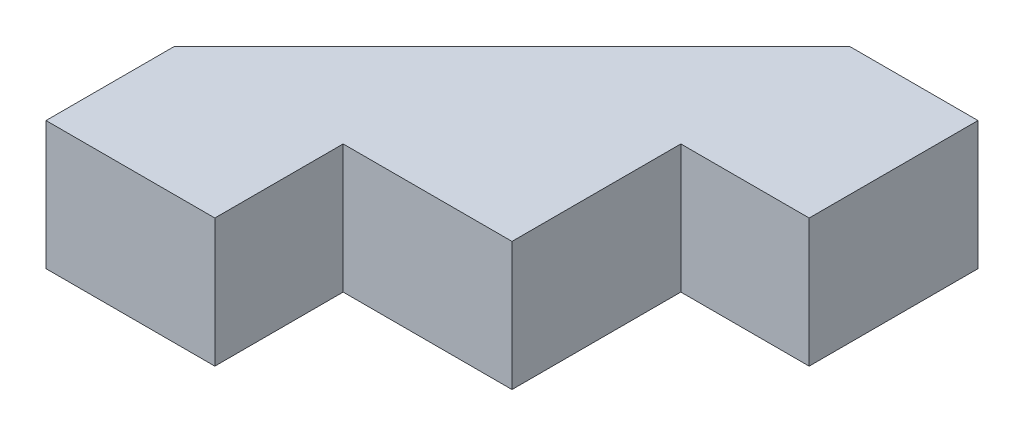
ISO-10303-21;
HEADER;
FILE_DESCRIPTION(('STEP AP214'),'2;1');
FILE_NAME('part.step','',(''),(''),'','','');
FILE_SCHEMA(('AUTOMOTIVE_DESIGN { 1 0 10303 214 1 1 1 1 }'));
ENDSEC;
DATA;
#1=APPLICATION_CONTEXT('core data for automotive mechanical design processes');
#2=APPLICATION_PROTOCOL_DEFINITION('international standard','automotive_design',2000,#1);
#3=PRODUCT_CONTEXT('',#1,'mechanical');
#4=PRODUCT('Part','Part','',(#3));
#5=PRODUCT_RELATED_PRODUCT_CATEGORY('part','',(#4));
#6=PRODUCT_DEFINITION_FORMATION('','',#4);
#7=PRODUCT_DEFINITION_CONTEXT('part definition',#1,'design');
#8=PRODUCT_DEFINITION('design','',#6,#7);
#9=PRODUCT_DEFINITION_SHAPE('','',#8);
#10=(LENGTH_UNIT() NAMED_UNIT(*) SI_UNIT(.MILLI.,.METRE.));
#11=(NAMED_UNIT(*) PLANE_ANGLE_UNIT() SI_UNIT($,.RADIAN.));
#12=(NAMED_UNIT(*) SI_UNIT($,.STERADIAN.) SOLID_ANGLE_UNIT());
#13=UNCERTAINTY_MEASURE_WITH_UNIT(LENGTH_MEASURE(1.E-05),#10,'distance_accuracy_value','');
#14=(GEOMETRIC_REPRESENTATION_CONTEXT(3) GLOBAL_UNCERTAINTY_ASSIGNED_CONTEXT((#13)) GLOBAL_UNIT_ASSIGNED_CONTEXT((#10,
#11,#12)) REPRESENTATION_CONTEXT('',''));
#15=CARTESIAN_POINT('',(0.,0.,0.));
#16=DIRECTION('',(0.,0.,1.));
#17=DIRECTION('',(1.,0.,0.));
#18=AXIS2_PLACEMENT_3D('',#15,#16,#17);
#19=CARTESIAN_POINT('',(-2.01198543722725,4.826,0.));
#20=DIRECTION('',(1.,0.,0.));
#21=DIRECTION('',(0.,0.,-1.));
#22=AXIS2_PLACEMENT_3D('',#19,#20,#21);
#23=PLANE('',#22);
#24=DIRECTION('',(0.,0.,1.));
#25=VECTOR('',#24,1.);
#26=CARTESIAN_POINT('',(-2.01198543722725,0.,0.));
#27=LINE('',#26,#25);
#28=CARTESIAN_POINT('',(-2.01198543722724,0.,13.62211422302));
#29=VERTEX_POINT('',#28);
#30=CARTESIAN_POINT('',(-2.01198543722724,0.,18.44811422302));
#31=VERTEX_POINT('',#30);
#32=EDGE_CURVE('E136',#29,#31,#27,.T.);
#33=ORIENTED_EDGE('',*,*,#32,.F.);
#34=DIRECTION('',(0.,-1.,0.));
#35=VECTOR('',#34,1.);
#36=CARTESIAN_POINT('',(-2.01198543722724,4.826,13.62211422302));
#37=LINE('',#36,#35);
#38=CARTESIAN_POINT('',(-2.01198543722724,4.826,13.62211422302));
#39=VERTEX_POINT('',#38);
#40=EDGE_CURVE('E11',#39,#29,#37,.T.);
#41=ORIENTED_EDGE('',*,*,#40,.F.);
#42=DIRECTION('',(0.,0.,1.));
#43=VECTOR('',#42,1.);
#44=CARTESIAN_POINT('',(-2.01198543722725,4.826,0.));
#45=LINE('',#44,#43);
#46=CARTESIAN_POINT('',(-2.01198543722724,4.826,18.44811422302));
#47=VERTEX_POINT('',#46);
#48=EDGE_CURVE('E158',#39,#47,#45,.T.);
#49=ORIENTED_EDGE('',*,*,#48,.T.);
#50=DIRECTION('',(0.,-1.,0.));
#51=VECTOR('',#50,1.);
#52=CARTESIAN_POINT('',(-2.01198543722724,4.826,18.44811422302));
#53=LINE('',#52,#51);
#54=EDGE_CURVE('E88',#47,#31,#53,.T.);
#55=ORIENTED_EDGE('',*,*,#54,.T.);
#56=EDGE_LOOP('',(#33,#41,#49,#55));
#57=FACE_BOUND('',#56,.T.);
#58=ADVANCED_FACE('F35',(#57),#23,.T.);
#59=CARTESIAN_POINT('',(0.,4.826,13.62211422302));
#60=DIRECTION('',(0.,0.,-1.));
#61=DIRECTION('',(-1.,0.,0.));
#62=AXIS2_PLACEMENT_3D('',#59,#60,#61);
#63=PLANE('',#62);
#64=DIRECTION('',(1.,0.,0.));
#65=VECTOR('',#64,1.);
#66=CARTESIAN_POINT('',(0.,0.,13.62211422302));
#67=LINE('',#66,#65);
#68=CARTESIAN_POINT('',(4.33801456277276,0.,13.62211422302));
#69=VERTEX_POINT('',#68);
#70=EDGE_CURVE('E139',#29,#69,#67,.T.);
#71=ORIENTED_EDGE('',*,*,#70,.T.);
#72=DIRECTION('',(0.,-1.,0.));
#73=VECTOR('',#72,1.);
#74=CARTESIAN_POINT('',(4.33801456277276,4.826,13.62211422302));
#75=LINE('',#74,#73);
#76=CARTESIAN_POINT('',(4.33801456277276,4.826,13.62211422302));
#77=VERTEX_POINT('',#76);
#78=EDGE_CURVE('E43',#77,#69,#75,.T.);
#79=ORIENTED_EDGE('',*,*,#78,.F.);
#80=DIRECTION('',(1.,0.,0.));
#81=VECTOR('',#80,1.);
#82=CARTESIAN_POINT('',(0.,4.826,13.62211422302));
#83=LINE('',#82,#81);
#84=EDGE_CURVE('E188',#39,#77,#83,.T.);
#85=ORIENTED_EDGE('',*,*,#84,.F.);
#86=ORIENTED_EDGE('',*,*,#40,.T.);
#87=EDGE_LOOP('',(#71,#79,#85,#86));
#88=FACE_BOUND('',#87,.T.);
#89=ADVANCED_FACE('F176',(#88),#63,.F.);
#90=CARTESIAN_POINT('',(4.33801456277276,4.826,0.));
#91=DIRECTION('',(1.,0.,0.));
#92=DIRECTION('',(0.,0.,-1.));
#93=AXIS2_PLACEMENT_3D('',#90,#91,#92);
#94=PLANE('',#93);
#95=DIRECTION('',(0.,0.,1.));
#96=VECTOR('',#95,1.);
#97=CARTESIAN_POINT('',(4.33801456277276,0.,0.));
#98=LINE('',#97,#96);
#99=CARTESIAN_POINT('',(4.33801456277276,0.,7.27211422302003));
#100=VERTEX_POINT('',#99);
#101=EDGE_CURVE('E142',#100,#69,#98,.T.);
#102=ORIENTED_EDGE('',*,*,#101,.F.);
#103=DIRECTION('',(0.,-1.,0.));
#104=VECTOR('',#103,1.);
#105=CARTESIAN_POINT('',(4.33801456277276,4.826,7.27211422302003));
#106=LINE('',#105,#104);
#107=CARTESIAN_POINT('',(4.33801456277276,4.826,7.27211422302003));
#108=VERTEX_POINT('',#107);
#109=EDGE_CURVE('E166',#108,#100,#106,.T.);
#110=ORIENTED_EDGE('',*,*,#109,.F.);
#111=DIRECTION('',(0.,0.,1.));
#112=VECTOR('',#111,1.);
#113=CARTESIAN_POINT('',(4.33801456277276,4.826,0.));
#114=LINE('',#113,#112);
#115=EDGE_CURVE('E173',#108,#77,#114,.T.);
#116=ORIENTED_EDGE('',*,*,#115,.T.);
#117=ORIENTED_EDGE('',*,*,#78,.T.);
#118=EDGE_LOOP('',(#102,#110,#116,#117));
#119=FACE_BOUND('',#118,.T.);
#120=ADVANCED_FACE('F171',(#119),#94,.T.);
#121=CARTESIAN_POINT('',(0.,4.826,7.27211422302003));
#122=DIRECTION('',(0.,0.,-1.));
#123=DIRECTION('',(-1.,0.,0.));
#124=AXIS2_PLACEMENT_3D('',#121,#122,#123);
#125=PLANE('',#124);
#126=DIRECTION('',(1.,0.,0.));
#127=VECTOR('',#126,1.);
#128=CARTESIAN_POINT('',(0.,0.,7.27211422302003));
#129=LINE('',#128,#127);
#130=CARTESIAN_POINT('',(9.16401456277275,0.,7.27211422302003));
#131=VERTEX_POINT('',#130);
#132=EDGE_CURVE('E145',#100,#131,#129,.T.);
#133=ORIENTED_EDGE('',*,*,#132,.T.);
#134=DIRECTION('',(0.,-1.,0.));
#135=VECTOR('',#134,1.);
#136=CARTESIAN_POINT('',(9.16401456277275,4.826,7.27211422302003));
#137=LINE('',#136,#135);
#138=CARTESIAN_POINT('',(9.16401456277275,4.826,7.27211422302003));
#139=VERTEX_POINT('',#138);
#140=EDGE_CURVE('E164',#139,#131,#137,.T.);
#141=ORIENTED_EDGE('',*,*,#140,.F.);
#142=DIRECTION('',(1.,0.,0.));
#143=VECTOR('',#142,1.);
#144=CARTESIAN_POINT('',(0.,4.826,7.27211422302003));
#145=LINE('',#144,#143);
#146=EDGE_CURVE('E186',#108,#139,#145,.T.);
#147=ORIENTED_EDGE('',*,*,#146,.F.);
#148=ORIENTED_EDGE('',*,*,#109,.T.);
#149=EDGE_LOOP('',(#133,#141,#147,#148));
#150=FACE_BOUND('',#149,.T.);
#151=ADVANCED_FACE('F183',(#150),#125,.F.);
#152=CARTESIAN_POINT('',(9.16401456277275,4.826,0.));
#153=DIRECTION('',(1.,0.,0.));
#154=DIRECTION('',(0.,0.,-1.));
#155=AXIS2_PLACEMENT_3D('',#152,#153,#154);
#156=PLANE('',#155);
#157=DIRECTION('',(0.,0.,1.));
#158=VECTOR('',#157,1.);
#159=CARTESIAN_POINT('',(9.16401456277275,0.,0.));
#160=LINE('',#159,#158);
#161=CARTESIAN_POINT('',(9.16401456277275,0.,0.922114223020031));
#162=VERTEX_POINT('',#161);
#163=EDGE_CURVE('E148',#162,#131,#160,.T.);
#164=ORIENTED_EDGE('',*,*,#163,.F.);
#165=DIRECTION('',(0.,-1.,0.));
#166=VECTOR('',#165,1.);
#167=CARTESIAN_POINT('',(9.16401456277275,4.826,0.922114223020031));
#168=LINE('',#167,#166);
#169=CARTESIAN_POINT('',(9.16401456277275,4.826,0.922114223020031));
#170=VERTEX_POINT('',#169);
#171=EDGE_CURVE('E162',#170,#162,#168,.T.);
#172=ORIENTED_EDGE('',*,*,#171,.F.);
#173=DIRECTION('',(0.,0.,1.));
#174=VECTOR('',#173,1.);
#175=CARTESIAN_POINT('',(9.16401456277275,4.826,0.));
#176=LINE('',#175,#174);
#177=EDGE_CURVE('E131',#170,#139,#176,.T.);
#178=ORIENTED_EDGE('',*,*,#177,.T.);
#179=ORIENTED_EDGE('',*,*,#140,.T.);
#180=EDGE_LOOP('',(#164,#172,#178,#179));
#181=FACE_BOUND('',#180,.T.);
#182=ADVANCED_FACE('F193',(#181),#156,.T.);
#183=CARTESIAN_POINT('',(0.,4.826,0.922114223020031));
#184=DIRECTION('',(0.,0.,-1.));
#185=DIRECTION('',(-1.,0.,0.));
#186=AXIS2_PLACEMENT_3D('',#183,#184,#185);
#187=PLANE('',#186);
#188=DIRECTION('',(1.,0.,0.));
#189=VECTOR('',#188,1.);
#190=CARTESIAN_POINT('',(0.,0.,0.922114223020031));
#191=LINE('',#190,#189);
#192=CARTESIAN_POINT('',(4.33801456277275,0.,0.922114223020032));
#193=VERTEX_POINT('',#192);
#194=EDGE_CURVE('E151',#193,#162,#191,.T.);
#195=ORIENTED_EDGE('',*,*,#194,.F.);
#196=DIRECTION('',(0.,-1.,0.));
#197=VECTOR('',#196,1.);
#198=CARTESIAN_POINT('',(4.33801456277275,4.826,0.922114223020032));
#199=LINE('',#198,#197);
#200=CARTESIAN_POINT('',(4.33801456277275,4.826,0.922114223020032));
#201=VERTEX_POINT('',#200);
#202=EDGE_CURVE('E119',#201,#193,#199,.T.);
#203=ORIENTED_EDGE('',*,*,#202,.F.);
#204=DIRECTION('',(1.,0.,0.));
#205=VECTOR('',#204,1.);
#206=CARTESIAN_POINT('',(0.,4.826,0.922114223020031));
#207=LINE('',#206,#205);
#208=EDGE_CURVE('E129',#201,#170,#207,.T.);
#209=ORIENTED_EDGE('',*,*,#208,.T.);
#210=ORIENTED_EDGE('',*,*,#171,.T.);
#211=EDGE_LOOP('',(#195,#203,#209,#210));
#212=FACE_BOUND('',#211,.T.);
#213=ADVANCED_FACE('F196',(#212),#187,.T.);
#214=CARTESIAN_POINT('',(2.63006439289639,4.826,2.63006439289639));
#215=DIRECTION('',(-0.707106781186547,0.,-0.707106781186547));
#216=DIRECTION('',(-0.707106781186548,0.,0.707106781186548));
#217=AXIS2_PLACEMENT_3D('',#214,#215,#216);
#218=PLANE('',#217);
#219=DIRECTION('',(0.707106781186548,0.,-0.707106781186548));
#220=VECTOR('',#219,1.);
#221=CARTESIAN_POINT('',(2.63006439289639,0.,2.63006439289639));
#222=LINE('',#221,#220);
#223=CARTESIAN_POINT('',(-8.36198543722724,0.,13.62211422302));
#224=VERTEX_POINT('',#223);
#225=EDGE_CURVE('E118',#224,#193,#222,.T.);
#226=ORIENTED_EDGE('',*,*,#225,.F.);
#227=DIRECTION('',(0.,-1.,0.));
#228=VECTOR('',#227,1.);
#229=CARTESIAN_POINT('',(-8.36198543722724,4.826,13.62211422302));
#230=LINE('',#229,#228);
#231=CARTESIAN_POINT('',(-8.36198543722724,4.826,13.62211422302));
#232=VERTEX_POINT('',#231);
#233=EDGE_CURVE('E112',#232,#224,#230,.T.);
#234=ORIENTED_EDGE('',*,*,#233,.F.);
#235=DIRECTION('',(0.707106781186548,0.,-0.707106781186548));
#236=VECTOR('',#235,1.);
#237=CARTESIAN_POINT('',(2.63006439289639,4.826,2.63006439289639));
#238=LINE('',#237,#236);
#239=EDGE_CURVE('E116',#232,#201,#238,.T.);
#240=ORIENTED_EDGE('',*,*,#239,.T.);
#241=ORIENTED_EDGE('',*,*,#202,.T.);
#242=EDGE_LOOP('',(#226,#234,#240,#241));
#243=FACE_BOUND('',#242,.T.);
#244=ADVANCED_FACE('F114',(#243),#218,.T.);
#245=CARTESIAN_POINT('',(-8.36198543722724,4.826,0.));
#246=DIRECTION('',(1.,0.,0.));
#247=DIRECTION('',(0.,0.,-1.));
#248=AXIS2_PLACEMENT_3D('',#245,#246,#247);
#249=PLANE('',#248);
#250=DIRECTION('',(0.,0.,1.));
#251=VECTOR('',#250,1.);
#252=CARTESIAN_POINT('',(-8.36198543722724,0.,0.));
#253=LINE('',#252,#251);
#254=CARTESIAN_POINT('',(-8.36198543722724,0.,18.44811422302));
#255=VERTEX_POINT('',#254);
#256=EDGE_CURVE('E81',#224,#255,#253,.T.);
#257=ORIENTED_EDGE('',*,*,#256,.T.);
#258=DIRECTION('',(0.,-1.,0.));
#259=VECTOR('',#258,1.);
#260=CARTESIAN_POINT('',(-8.36198543722724,4.826,18.44811422302));
#261=LINE('',#260,#259);
#262=CARTESIAN_POINT('',(-8.36198543722724,4.826,18.44811422302));
#263=VERTEX_POINT('',#262);
#264=EDGE_CURVE('E120',#263,#255,#261,.T.);
#265=ORIENTED_EDGE('',*,*,#264,.F.);
#266=DIRECTION('',(0.,0.,1.));
#267=VECTOR('',#266,1.);
#268=CARTESIAN_POINT('',(-8.36198543722724,4.826,0.));
#269=LINE('',#268,#267);
#270=EDGE_CURVE('E122',#232,#263,#269,.T.);
#271=ORIENTED_EDGE('',*,*,#270,.F.);
#272=ORIENTED_EDGE('',*,*,#233,.T.);
#273=EDGE_LOOP('',(#257,#265,#271,#272));
#274=FACE_BOUND('',#273,.T.);
#275=ADVANCED_FACE('F123',(#274),#249,.F.);
#276=CARTESIAN_POINT('',(0.,4.826,18.44811422302));
#277=DIRECTION('',(0.,0.,-1.));
#278=DIRECTION('',(-1.,0.,0.));
#279=AXIS2_PLACEMENT_3D('',#276,#277,#278);
#280=PLANE('',#279);
#281=DIRECTION('',(1.,0.,0.));
#282=VECTOR('',#281,1.);
#283=CARTESIAN_POINT('',(0.,0.,18.44811422302));
#284=LINE('',#283,#282);
#285=EDGE_CURVE('E156',#255,#31,#284,.T.);
#286=ORIENTED_EDGE('',*,*,#285,.T.);
#287=ORIENTED_EDGE('',*,*,#54,.F.);
#288=DIRECTION('',(1.,0.,0.));
#289=VECTOR('',#288,1.);
#290=CARTESIAN_POINT('',(0.,4.826,18.44811422302));
#291=LINE('',#290,#289);
#292=EDGE_CURVE('E51',#263,#47,#291,.T.);
#293=ORIENTED_EDGE('',*,*,#292,.F.);
#294=ORIENTED_EDGE('',*,*,#264,.T.);
#295=EDGE_LOOP('',(#286,#287,#293,#294));
#296=FACE_BOUND('',#295,.T.);
#297=ADVANCED_FACE('F199',(#296),#280,.F.);
#298=CARTESIAN_POINT('',(0.,4.826,0.));
#299=DIRECTION('',(0.,1.,0.));
#300=DIRECTION('',(0.,0.,1.));
#301=AXIS2_PLACEMENT_3D('',#298,#299,#300);
#302=PLANE('',#301);
#303=ORIENTED_EDGE('',*,*,#48,.F.);
#304=ORIENTED_EDGE('',*,*,#84,.T.);
#305=ORIENTED_EDGE('',*,*,#115,.F.);
#306=ORIENTED_EDGE('',*,*,#146,.T.);
#307=ORIENTED_EDGE('',*,*,#177,.F.);
#308=ORIENTED_EDGE('',*,*,#208,.F.);
#309=ORIENTED_EDGE('',*,*,#239,.F.);
#310=ORIENTED_EDGE('',*,*,#270,.T.);
#311=ORIENTED_EDGE('',*,*,#292,.T.);
#312=EDGE_LOOP('',(#303,#304,#305,#306,#307,#308,#309,#310,#311));
#313=FACE_BOUND('',#312,.T.);
#314=ADVANCED_FACE('F126',(#313),#302,.T.);
#315=CARTESIAN_POINT('',(0.,0.,0.));
#316=DIRECTION('',(0.,1.,0.));
#317=DIRECTION('',(0.,0.,1.));
#318=AXIS2_PLACEMENT_3D('',#315,#316,#317);
#319=PLANE('',#318);
#320=ORIENTED_EDGE('',*,*,#32,.T.);
#321=ORIENTED_EDGE('',*,*,#285,.F.);
#322=ORIENTED_EDGE('',*,*,#256,.F.);
#323=ORIENTED_EDGE('',*,*,#225,.T.);
#324=ORIENTED_EDGE('',*,*,#194,.T.);
#325=ORIENTED_EDGE('',*,*,#163,.T.);
#326=ORIENTED_EDGE('',*,*,#132,.F.);
#327=ORIENTED_EDGE('',*,*,#101,.T.);
#328=ORIENTED_EDGE('',*,*,#70,.F.);
#329=EDGE_LOOP('',(#320,#321,#322,#323,#324,#325,#326,#327,#328));
#330=FACE_BOUND('',#329,.T.);
#331=ADVANCED_FACE('F179',(#330),#319,.F.);
#332=CLOSED_SHELL('',(#58,#89,#120,#151,#182,#213,#244,#275,#297,#314,#331));
#333=MANIFOLD_SOLID_BREP('B2',#332);
#334=ADVANCED_BREP_SHAPE_REPRESENTATION('',(#18,#333),#14);
#335=SHAPE_DEFINITION_REPRESENTATION(#9,#334);
ENDSEC;
END-ISO-10303-21;
